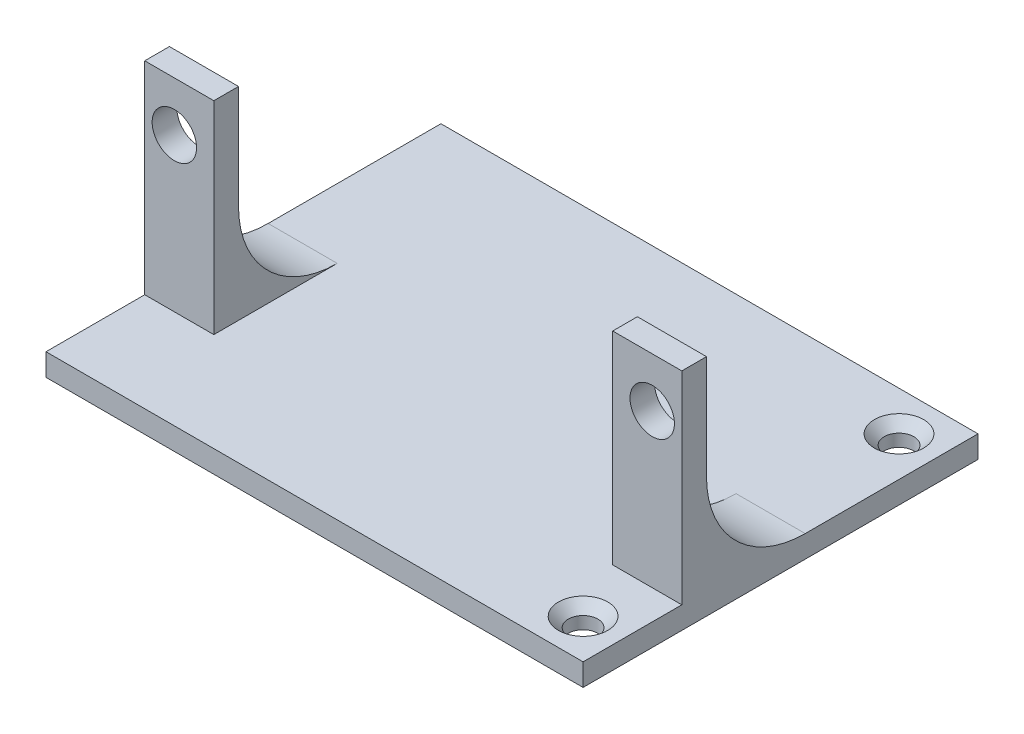
ISO-10303-21;
HEADER;
FILE_DESCRIPTION(('STEP AP214'),'2;1');
FILE_NAME('part.step','',(''),(''),'','','');
FILE_SCHEMA(('AUTOMOTIVE_DESIGN { 1 0 10303 214 1 1 1 1 }'));
ENDSEC;
DATA;
#1=APPLICATION_CONTEXT('core data for automotive mechanical design processes');
#2=APPLICATION_PROTOCOL_DEFINITION('international standard','automotive_design',2000,#1);
#3=PRODUCT_CONTEXT('',#1,'mechanical');
#4=PRODUCT('Part','Part','',(#3));
#5=PRODUCT_RELATED_PRODUCT_CATEGORY('part','',(#4));
#6=PRODUCT_DEFINITION_FORMATION('','',#4);
#7=PRODUCT_DEFINITION_CONTEXT('part definition',#1,'design');
#8=PRODUCT_DEFINITION('design','',#6,#7);
#9=PRODUCT_DEFINITION_SHAPE('','',#8);
#10=(LENGTH_UNIT() NAMED_UNIT(*) SI_UNIT(.MILLI.,.METRE.));
#11=(NAMED_UNIT(*) PLANE_ANGLE_UNIT() SI_UNIT($,.RADIAN.));
#12=(NAMED_UNIT(*) SI_UNIT($,.STERADIAN.) SOLID_ANGLE_UNIT());
#13=UNCERTAINTY_MEASURE_WITH_UNIT(LENGTH_MEASURE(1.E-05),#10,'distance_accuracy_value','');
#14=(GEOMETRIC_REPRESENTATION_CONTEXT(3) GLOBAL_UNCERTAINTY_ASSIGNED_CONTEXT((#13)) GLOBAL_UNIT_ASSIGNED_CONTEXT((#10,
#11,#12)) REPRESENTATION_CONTEXT('',''));
#15=CARTESIAN_POINT('',(0.,0.,0.));
#16=DIRECTION('',(0.,0.,1.));
#17=DIRECTION('',(1.,0.,0.));
#18=AXIS2_PLACEMENT_3D('',#15,#16,#17);
#19=CARTESIAN_POINT('',(0.,0.,6.));
#20=DIRECTION('',(0.,0.,1.));
#21=DIRECTION('',(1.,0.,0.));
#22=AXIS2_PLACEMENT_3D('',#19,#20,#21);
#23=PLANE('',#22);
#24=DIRECTION('',(-1.,0.,0.));
#25=VECTOR('',#24,1.);
#26=CARTESIAN_POINT('',(3.5,2.5,6.));
#27=LINE('',#26,#25);
#28=CARTESIAN_POINT('',(3.5,2.5,6.));
#29=VERTEX_POINT('',#28);
#30=CARTESIAN_POINT('',(-3.5,2.5,6.));
#31=VERTEX_POINT('',#30);
#32=EDGE_CURVE('E295',#29,#31,#27,.T.);
#33=ORIENTED_EDGE('',*,*,#32,.F.);
#34=DIRECTION('',(0.,1.,0.));
#35=VECTOR('',#34,1.);
#36=CARTESIAN_POINT('',(3.5,3.,6.));
#37=LINE('',#36,#35);
#38=CARTESIAN_POINT('',(3.5,23.02,6.));
#39=VERTEX_POINT('',#38);
#40=EDGE_CURVE('E225',#29,#39,#37,.T.);
#41=ORIENTED_EDGE('',*,*,#40,.T.);
#42=DIRECTION('',(-1.,0.,0.));
#43=VECTOR('',#42,1.);
#44=CARTESIAN_POINT('',(3.5,23.02,6.));
#45=LINE('',#44,#43);
#46=CARTESIAN_POINT('',(-3.5,23.02,6.));
#47=VERTEX_POINT('',#46);
#48=EDGE_CURVE('E229',#39,#47,#45,.T.);
#49=ORIENTED_EDGE('',*,*,#48,.T.);
#50=DIRECTION('',(0.,-1.,0.));
#51=VECTOR('',#50,1.);
#52=CARTESIAN_POINT('',(-3.5,3.,6.));
#53=LINE('',#52,#51);
#54=EDGE_CURVE('E222',#47,#31,#53,.T.);
#55=ORIENTED_EDGE('',*,*,#54,.T.);
#56=EDGE_LOOP('',(#33,#41,#49,#55));
#57=FACE_BOUND('',#56,.T.);
#58=CARTESIAN_POINT('',(0.500000000000005,18.01,6.));
#59=DIRECTION('',(0.,0.,1.));
#60=DIRECTION('',(1.,0.,0.));
#61=AXIS2_PLACEMENT_3D('',#58,#59,#60);
#62=CIRCLE('',#61,2.25);
#63=CARTESIAN_POINT('',(2.75000000000001,18.01,6.));
#64=VERTEX_POINT('',#63);
#65=EDGE_CURVE('E214',#64,#64,#62,.T.);
#66=ORIENTED_EDGE('',*,*,#65,.F.);
#67=EDGE_LOOP('',(#66));
#68=FACE_BOUND('',#67,.T.);
#69=ADVANCED_FACE('F45',(#57,#68),#23,.T.);
#70=CARTESIAN_POINT('',(0.,0.,-24.));
#71=DIRECTION('',(0.,0.,-1.));
#72=DIRECTION('',(-1.,0.,0.));
#73=AXIS2_PLACEMENT_3D('',#70,#71,#72);
#74=PLANE('',#73);
#75=DIRECTION('',(-1.,0.,0.));
#76=VECTOR('',#75,1.);
#77=CARTESIAN_POINT('',(3.5,0.25,-24.));
#78=LINE('',#77,#76);
#79=CARTESIAN_POINT('',(3.5,0.25,-24.));
#80=VERTEX_POINT('',#79);
#81=CARTESIAN_POINT('',(-50.9,0.25,-24.));
#82=VERTEX_POINT('',#81);
#83=EDGE_CURVE('E146',#80,#82,#78,.T.);
#84=ORIENTED_EDGE('',*,*,#83,.T.);
#85=DIRECTION('',(0.,1.,0.));
#86=VECTOR('',#85,1.);
#87=CARTESIAN_POINT('',(-50.9,-2.,-24.));
#88=LINE('',#87,#86);
#89=CARTESIAN_POINT('',(-50.9,2.5,-24.));
#90=VERTEX_POINT('',#89);
#91=EDGE_CURVE('E174',#82,#90,#88,.T.);
#92=ORIENTED_EDGE('',*,*,#91,.T.);
#93=DIRECTION('',(-1.,0.,0.));
#94=VECTOR('',#93,1.);
#95=CARTESIAN_POINT('',(3.5,2.5,-24.));
#96=LINE('',#95,#94);
#97=CARTESIAN_POINT('',(3.5,2.5,-24.));
#98=VERTEX_POINT('',#97);
#99=EDGE_CURVE('E171',#98,#90,#96,.T.);
#100=ORIENTED_EDGE('',*,*,#99,.F.);
#101=DIRECTION('',(0.,-1.,0.));
#102=VECTOR('',#101,1.);
#103=CARTESIAN_POINT('',(3.5,3.,-24.));
#104=LINE('',#103,#102);
#105=EDGE_CURVE('E163',#98,#80,#104,.T.);
#106=ORIENTED_EDGE('',*,*,#105,.T.);
#107=EDGE_LOOP('',(#84,#92,#100,#106));
#108=FACE_BOUND('',#107,.T.);
#109=ADVANCED_FACE('F169',(#108),#74,.T.);
#110=CARTESIAN_POINT('',(-3.5,3.,-3.5));
#111=DIRECTION('',(1.,0.,0.));
#112=DIRECTION('',(0.,0.,-1.));
#113=AXIS2_PLACEMENT_3D('',#110,#111,#112);
#114=PLANE('',#113);
#115=DIRECTION('',(0.,-1.,0.));
#116=VECTOR('',#115,1.);
#117=CARTESIAN_POINT('',(-3.5,23.02,3.5));
#118=LINE('',#117,#116);
#119=CARTESIAN_POINT('',(-3.5,23.02,3.5));
#120=VERTEX_POINT('',#119);
#121=CARTESIAN_POINT('',(-3.5,12.5,3.5));
#122=VERTEX_POINT('',#121);
#123=EDGE_CURVE('E226',#120,#122,#118,.T.);
#124=ORIENTED_EDGE('',*,*,#123,.T.);
#125=CARTESIAN_POINT('',(-3.5,12.5,-6.5));
#126=DIRECTION('',(1.,0.,0.));
#127=DIRECTION('',(0.,0.,-1.));
#128=AXIS2_PLACEMENT_3D('',#125,#126,#127);
#129=CIRCLE('',#128,10.);
#130=CARTESIAN_POINT('',(-3.5,2.5,-6.5));
#131=VERTEX_POINT('',#130);
#132=EDGE_CURVE('E11',#122,#131,#129,.T.);
#133=ORIENTED_EDGE('',*,*,#132,.T.);
#134=DIRECTION('',(0.,0.,-1.));
#135=VECTOR('',#134,1.);
#136=CARTESIAN_POINT('',(-3.5,2.5,6.));
#137=LINE('',#136,#135);
#138=EDGE_CURVE('E181',#31,#131,#137,.T.);
#139=ORIENTED_EDGE('',*,*,#138,.F.);
#140=ORIENTED_EDGE('',*,*,#54,.F.);
#141=DIRECTION('',(0.,0.,-1.));
#142=VECTOR('',#141,1.);
#143=CARTESIAN_POINT('',(-3.5,23.02,6.));
#144=LINE('',#143,#142);
#145=EDGE_CURVE('E233',#47,#120,#144,.T.);
#146=ORIENTED_EDGE('',*,*,#145,.T.);
#147=EDGE_LOOP('',(#124,#133,#139,#140,#146));
#148=FACE_BOUND('',#147,.T.);
#149=ADVANCED_FACE('F346',(#148),#114,.F.);
#150=CARTESIAN_POINT('',(3.5,3.,-3.5));
#151=DIRECTION('',(-1.,0.,0.));
#152=DIRECTION('',(0.,0.,1.));
#153=AXIS2_PLACEMENT_3D('',#150,#151,#152);
#154=PLANE('',#153);
#155=DIRECTION('',(0.,1.,0.));
#156=VECTOR('',#155,1.);
#157=CARTESIAN_POINT('',(3.5,2.5,16.));
#158=LINE('',#157,#156);
#159=CARTESIAN_POINT('',(3.5,0.25,16.));
#160=VERTEX_POINT('',#159);
#161=CARTESIAN_POINT('',(3.5,2.5,16.));
#162=VERTEX_POINT('',#161);
#163=EDGE_CURVE('E165',#160,#162,#158,.T.);
#164=ORIENTED_EDGE('',*,*,#163,.F.);
#165=DIRECTION('',(0.,0.,1.));
#166=VECTOR('',#165,1.);
#167=CARTESIAN_POINT('',(3.5,0.25,-24.));
#168=LINE('',#167,#166);
#169=EDGE_CURVE('E150',#80,#160,#168,.T.);
#170=ORIENTED_EDGE('',*,*,#169,.F.);
#171=ORIENTED_EDGE('',*,*,#105,.F.);
#172=DIRECTION('',(0.,0.,-1.));
#173=VECTOR('',#172,1.);
#174=CARTESIAN_POINT('',(3.5,2.5,3.5));
#175=LINE('',#174,#173);
#176=CARTESIAN_POINT('',(3.5,2.5,-6.5));
#177=VERTEX_POINT('',#176);
#178=EDGE_CURVE('E327',#177,#98,#175,.T.);
#179=ORIENTED_EDGE('',*,*,#178,.F.);
#180=CARTESIAN_POINT('',(3.5,12.5,-6.5));
#181=DIRECTION('',(-1.,0.,0.));
#182=DIRECTION('',(0.,0.,1.));
#183=AXIS2_PLACEMENT_3D('',#180,#181,#182);
#184=CIRCLE('',#183,10.);
#185=CARTESIAN_POINT('',(3.5,12.5,3.5));
#186=VERTEX_POINT('',#185);
#187=EDGE_CURVE('E54',#177,#186,#184,.T.);
#188=ORIENTED_EDGE('',*,*,#187,.T.);
#189=DIRECTION('',(0.,1.,0.));
#190=VECTOR('',#189,1.);
#191=CARTESIAN_POINT('',(3.5,3.,3.5));
#192=LINE('',#191,#190);
#193=CARTESIAN_POINT('',(3.5,23.02,3.5));
#194=VERTEX_POINT('',#193);
#195=EDGE_CURVE('E218',#186,#194,#192,.T.);
#196=ORIENTED_EDGE('',*,*,#195,.T.);
#197=DIRECTION('',(0.,0.,-1.));
#198=VECTOR('',#197,1.);
#199=CARTESIAN_POINT('',(3.5,23.02,6.));
#200=LINE('',#199,#198);
#201=EDGE_CURVE('E244',#39,#194,#200,.T.);
#202=ORIENTED_EDGE('',*,*,#201,.F.);
#203=ORIENTED_EDGE('',*,*,#40,.F.);
#204=DIRECTION('',(0.,0.,-1.));
#205=VECTOR('',#204,1.);
#206=CARTESIAN_POINT('',(3.5,2.5,16.));
#207=LINE('',#206,#205);
#208=EDGE_CURVE('E323',#162,#29,#207,.T.);
#209=ORIENTED_EDGE('',*,*,#208,.F.);
#210=EDGE_LOOP('',(#164,#170,#171,#179,#188,#196,#202,#203,#209));
#211=FACE_BOUND('',#210,.T.);
#212=ADVANCED_FACE('F162',(#211),#154,.F.);
#213=CARTESIAN_POINT('',(-43.9,2.5,6.));
#214=VERTEX_POINT('',#213);
#215=CARTESIAN_POINT('',(-50.9,2.5,6.));
#216=VERTEX_POINT('',#215);
#217=EDGE_CURVE('E248',#214,#216,#27,.T.);
#218=ORIENTED_EDGE('',*,*,#217,.F.);
#219=DIRECTION('',(0.,1.,0.));
#220=VECTOR('',#219,1.);
#221=CARTESIAN_POINT('',(-43.9,3.,6.));
#222=LINE('',#221,#220);
#223=CARTESIAN_POINT('',(-43.9,23.02,6.));
#224=VERTEX_POINT('',#223);
#225=EDGE_CURVE('E197',#214,#224,#222,.T.);
#226=ORIENTED_EDGE('',*,*,#225,.T.);
#227=DIRECTION('',(1.,0.,0.));
#228=VECTOR('',#227,1.);
#229=CARTESIAN_POINT('',(-50.9,23.02,6.00000000000001));
#230=LINE('',#229,#228);
#231=CARTESIAN_POINT('',(-50.9,23.02,6.00000000000001));
#232=VERTEX_POINT('',#231);
#233=EDGE_CURVE('E209',#232,#224,#230,.T.);
#234=ORIENTED_EDGE('',*,*,#233,.F.);
#235=DIRECTION('',(0.,1.,0.));
#236=VECTOR('',#235,1.);
#237=CARTESIAN_POINT('',(-50.9,-2.,6.00000000000001));
#238=LINE('',#237,#236);
#239=EDGE_CURVE('E185',#216,#232,#238,.T.);
#240=ORIENTED_EDGE('',*,*,#239,.F.);
#241=EDGE_LOOP('',(#218,#226,#234,#240));
#242=FACE_BOUND('',#241,.T.);
#243=CARTESIAN_POINT('',(-47.9,18.01,6.));
#244=DIRECTION('',(0.,0.,1.));
#245=DIRECTION('',(-1.,0.,0.));
#246=AXIS2_PLACEMENT_3D('',#243,#244,#245);
#247=CIRCLE('',#246,2.25);
#248=CARTESIAN_POINT('',(-50.15,18.01,6.));
#249=VERTEX_POINT('',#248);
#250=EDGE_CURVE('E173',#249,#249,#247,.T.);
#251=ORIENTED_EDGE('',*,*,#250,.F.);
#252=EDGE_LOOP('',(#251));
#253=FACE_BOUND('',#252,.T.);
#254=ADVANCED_FACE('F357',(#242,#253),#23,.T.);
#255=CARTESIAN_POINT('',(0.,0.,3.5));
#256=DIRECTION('',(0.,0.,1.));
#257=DIRECTION('',(1.,0.,0.));
#258=AXIS2_PLACEMENT_3D('',#255,#256,#257);
#259=PLANE('',#258);
#260=ORIENTED_EDGE('',*,*,#195,.F.);
#261=DIRECTION('',(1.,0.,0.));
#262=VECTOR('',#261,1.);
#263=CARTESIAN_POINT('',(0.,12.5,3.5));
#264=LINE('',#263,#262);
#265=EDGE_CURVE('E61',#186,#122,#264,.F.);
#266=ORIENTED_EDGE('',*,*,#265,.T.);
#267=ORIENTED_EDGE('',*,*,#123,.F.);
#268=DIRECTION('',(-1.,0.,0.));
#269=VECTOR('',#268,1.);
#270=CARTESIAN_POINT('',(3.5,23.02,3.5));
#271=LINE('',#270,#269);
#272=EDGE_CURVE('E236',#194,#120,#271,.T.);
#273=ORIENTED_EDGE('',*,*,#272,.F.);
#274=EDGE_LOOP('',(#260,#266,#267,#273));
#275=FACE_BOUND('',#274,.T.);
#276=CARTESIAN_POINT('',(0.500000000000005,18.01,3.5));
#277=DIRECTION('',(0.,0.,1.));
#278=DIRECTION('',(1.,0.,0.));
#279=AXIS2_PLACEMENT_3D('',#276,#277,#278);
#280=CIRCLE('',#279,2.25);
#281=CARTESIAN_POINT('',(2.75000000000001,18.01,3.5));
#282=VERTEX_POINT('',#281);
#283=EDGE_CURVE('E213',#282,#282,#280,.T.);
#284=ORIENTED_EDGE('',*,*,#283,.T.);
#285=EDGE_LOOP('',(#284));
#286=FACE_BOUND('',#285,.T.);
#287=ADVANCED_FACE('F366',(#275,#286),#259,.F.);
#288=CARTESIAN_POINT('',(3.5,23.02,6.));
#289=DIRECTION('',(0.,-1.,0.));
#290=DIRECTION('',(0.,0.,-1.));
#291=AXIS2_PLACEMENT_3D('',#288,#289,#290);
#292=PLANE('',#291);
#293=ORIENTED_EDGE('',*,*,#272,.T.);
#294=ORIENTED_EDGE('',*,*,#145,.F.);
#295=ORIENTED_EDGE('',*,*,#48,.F.);
#296=ORIENTED_EDGE('',*,*,#201,.T.);
#297=EDGE_LOOP('',(#293,#294,#295,#296));
#298=FACE_BOUND('',#297,.T.);
#299=ADVANCED_FACE('F372',(#298),#292,.F.);
#300=CARTESIAN_POINT('',(0.500000000000005,18.01,6.));
#301=DIRECTION('',(0.,0.,-1.));
#302=DIRECTION('',(-1.,0.,0.));
#303=AXIS2_PLACEMENT_3D('',#300,#301,#302);
#304=CYLINDRICAL_SURFACE('',#303,2.25);
#305=ORIENTED_EDGE('',*,*,#65,.T.);
#306=EDGE_LOOP('',(#305));
#307=FACE_BOUND('',#306,.T.);
#308=ORIENTED_EDGE('',*,*,#283,.F.);
#309=EDGE_LOOP('',(#308));
#310=FACE_BOUND('',#309,.T.);
#311=ADVANCED_FACE('F405',(#307,#310),#304,.F.);
#312=CARTESIAN_POINT('',(-50.9,23.02,6.00000000000001));
#313=DIRECTION('',(0.,-1.,0.));
#314=DIRECTION('',(0.,0.,-1.));
#315=AXIS2_PLACEMENT_3D('',#312,#313,#314);
#316=PLANE('',#315);
#317=DIRECTION('',(0.,0.,-1.));
#318=VECTOR('',#317,1.);
#319=CARTESIAN_POINT('',(-43.9,23.02,6.));
#320=LINE('',#319,#318);
#321=CARTESIAN_POINT('',(-43.9,23.02,3.5));
#322=VERTEX_POINT('',#321);
#323=EDGE_CURVE('E200',#224,#322,#320,.T.);
#324=ORIENTED_EDGE('',*,*,#323,.T.);
#325=DIRECTION('',(1.,0.,0.));
#326=VECTOR('',#325,1.);
#327=CARTESIAN_POINT('',(-50.9,23.02,3.50000000000001));
#328=LINE('',#327,#326);
#329=CARTESIAN_POINT('',(-50.9,23.02,3.50000000000001));
#330=VERTEX_POINT('',#329);
#331=EDGE_CURVE('E196',#330,#322,#328,.T.);
#332=ORIENTED_EDGE('',*,*,#331,.F.);
#333=DIRECTION('',(0.,0.,-1.));
#334=VECTOR('',#333,1.);
#335=CARTESIAN_POINT('',(-50.9,23.02,6.00000000000001));
#336=LINE('',#335,#334);
#337=EDGE_CURVE('E188',#232,#330,#336,.T.);
#338=ORIENTED_EDGE('',*,*,#337,.F.);
#339=ORIENTED_EDGE('',*,*,#233,.T.);
#340=EDGE_LOOP('',(#324,#332,#338,#339));
#341=FACE_BOUND('',#340,.T.);
#342=ADVANCED_FACE('F389',(#341),#316,.F.);
#343=CARTESIAN_POINT('',(-50.9,23.02,3.50000000000001));
#344=DIRECTION('',(0.,0.,1.));
#345=DIRECTION('',(1.,0.,0.));
#346=AXIS2_PLACEMENT_3D('',#343,#344,#345);
#347=PLANE('',#346);
#348=CARTESIAN_POINT('',(-47.9,18.01,3.5));
#349=DIRECTION('',(0.,0.,1.));
#350=DIRECTION('',(1.,0.,0.));
#351=AXIS2_PLACEMENT_3D('',#348,#349,#350);
#352=CIRCLE('',#351,2.25);
#353=CARTESIAN_POINT('',(-45.65,18.01,3.5));
#354=VERTEX_POINT('',#353);
#355=EDGE_CURVE('E179',#354,#354,#352,.T.);
#356=ORIENTED_EDGE('',*,*,#355,.T.);
#357=EDGE_LOOP('',(#356));
#358=FACE_BOUND('',#357,.T.);
#359=DIRECTION('',(0.,-1.,0.));
#360=VECTOR('',#359,1.);
#361=CARTESIAN_POINT('',(-43.9,23.02,3.5));
#362=LINE('',#361,#360);
#363=CARTESIAN_POINT('',(-43.9,12.5,3.5));
#364=VERTEX_POINT('',#363);
#365=EDGE_CURVE('E189',#322,#364,#362,.T.);
#366=ORIENTED_EDGE('',*,*,#365,.T.);
#367=DIRECTION('',(1.,0.,0.));
#368=VECTOR('',#367,1.);
#369=CARTESIAN_POINT('',(-50.9,12.5,3.50000000000001));
#370=LINE('',#369,#368);
#371=CARTESIAN_POINT('',(-50.9,12.5,3.50000000000001));
#372=VERTEX_POINT('',#371);
#373=EDGE_CURVE('E281',#364,#372,#370,.F.);
#374=ORIENTED_EDGE('',*,*,#373,.T.);
#375=DIRECTION('',(0.,-1.,0.));
#376=VECTOR('',#375,1.);
#377=CARTESIAN_POINT('',(-50.9,23.02,3.50000000000001));
#378=LINE('',#377,#376);
#379=EDGE_CURVE('E192',#330,#372,#378,.T.);
#380=ORIENTED_EDGE('',*,*,#379,.F.);
#381=ORIENTED_EDGE('',*,*,#331,.T.);
#382=EDGE_LOOP('',(#366,#374,#380,#381));
#383=FACE_BOUND('',#382,.T.);
#384=ADVANCED_FACE('F385',(#358,#383),#347,.F.);
#385=CARTESIAN_POINT('',(-50.9,0.,0.));
#386=DIRECTION('',(1.,0.,0.));
#387=DIRECTION('',(0.,0.,-1.));
#388=AXIS2_PLACEMENT_3D('',#385,#386,#387);
#389=PLANE('',#388);
#390=ORIENTED_EDGE('',*,*,#91,.F.);
#391=DIRECTION('',(0.,0.,1.));
#392=VECTOR('',#391,1.);
#393=CARTESIAN_POINT('',(-50.9,0.25,-24.));
#394=LINE('',#393,#392);
#395=CARTESIAN_POINT('',(-50.9,0.25,16.));
#396=VERTEX_POINT('',#395);
#397=EDGE_CURVE('E153',#82,#396,#394,.T.);
#398=ORIENTED_EDGE('',*,*,#397,.T.);
#399=DIRECTION('',(0.,-1.,0.));
#400=VECTOR('',#399,1.);
#401=CARTESIAN_POINT('',(-50.9,2.5,16.));
#402=LINE('',#401,#400);
#403=CARTESIAN_POINT('',(-50.9,2.5,16.));
#404=VERTEX_POINT('',#403);
#405=EDGE_CURVE('E304',#404,#396,#402,.T.);
#406=ORIENTED_EDGE('',*,*,#405,.F.);
#407=DIRECTION('',(0.,0.,-1.));
#408=VECTOR('',#407,1.);
#409=CARTESIAN_POINT('',(-50.9,2.5,16.));
#410=LINE('',#409,#408);
#411=EDGE_CURVE('E319',#404,#216,#410,.T.);
#412=ORIENTED_EDGE('',*,*,#411,.T.);
#413=ORIENTED_EDGE('',*,*,#239,.T.);
#414=ORIENTED_EDGE('',*,*,#337,.T.);
#415=ORIENTED_EDGE('',*,*,#379,.T.);
#416=CARTESIAN_POINT('',(-50.9,12.5,-6.5));
#417=DIRECTION('',(1.,0.,0.));
#418=DIRECTION('',(0.,0.,-1.));
#419=AXIS2_PLACEMENT_3D('',#416,#417,#418);
#420=CIRCLE('',#419,10.);
#421=CARTESIAN_POINT('',(-50.9,2.5,-6.5));
#422=VERTEX_POINT('',#421);
#423=EDGE_CURVE('E289',#372,#422,#420,.T.);
#424=ORIENTED_EDGE('',*,*,#423,.T.);
#425=DIRECTION('',(0.,0.,1.));
#426=VECTOR('',#425,1.);
#427=CARTESIAN_POINT('',(-50.9,2.5,-24.));
#428=LINE('',#427,#426);
#429=EDGE_CURVE('E334',#90,#422,#428,.T.);
#430=ORIENTED_EDGE('',*,*,#429,.F.);
#431=EDGE_LOOP('',(#390,#398,#406,#412,#413,#414,#415,#424,#430));
#432=FACE_BOUND('',#431,.T.);
#433=ADVANCED_FACE('F388',(#432),#389,.F.);
#434=CARTESIAN_POINT('',(-43.9,0.,0.));
#435=DIRECTION('',(1.,0.,0.));
#436=DIRECTION('',(0.,0.,-1.));
#437=AXIS2_PLACEMENT_3D('',#434,#435,#436);
#438=PLANE('',#437);
#439=ORIENTED_EDGE('',*,*,#225,.F.);
#440=DIRECTION('',(0.,0.,1.));
#441=VECTOR('',#440,1.);
#442=CARTESIAN_POINT('',(-43.9,2.5,3.5));
#443=LINE('',#442,#441);
#444=CARTESIAN_POINT('',(-43.9,2.5,-6.5));
#445=VERTEX_POINT('',#444);
#446=EDGE_CURVE('E338',#445,#214,#443,.T.);
#447=ORIENTED_EDGE('',*,*,#446,.F.);
#448=CARTESIAN_POINT('',(-43.9,12.5,-6.5));
#449=DIRECTION('',(1.,0.,0.));
#450=DIRECTION('',(0.,0.,-1.));
#451=AXIS2_PLACEMENT_3D('',#448,#449,#450);
#452=CIRCLE('',#451,10.);
#453=EDGE_CURVE('E286',#445,#364,#452,.F.);
#454=ORIENTED_EDGE('',*,*,#453,.T.);
#455=ORIENTED_EDGE('',*,*,#365,.F.);
#456=ORIENTED_EDGE('',*,*,#323,.F.);
#457=EDGE_LOOP('',(#439,#447,#454,#455,#456));
#458=FACE_BOUND('',#457,.T.);
#459=ADVANCED_FACE('F381',(#458),#438,.T.);
#460=CARTESIAN_POINT('',(-47.9,18.01,1.5));
#461=DIRECTION('',(0.,0.,1.));
#462=DIRECTION('',(1.,0.,0.));
#463=AXIS2_PLACEMENT_3D('',#460,#461,#462);
#464=CYLINDRICAL_SURFACE('',#463,2.25);
#465=ORIENTED_EDGE('',*,*,#250,.T.);
#466=EDGE_LOOP('',(#465));
#467=FACE_BOUND('',#466,.T.);
#468=ORIENTED_EDGE('',*,*,#355,.F.);
#469=EDGE_LOOP('',(#468));
#470=FACE_BOUND('',#469,.T.);
#471=ADVANCED_FACE('F378',(#467,#470),#464,.F.);
#472=CARTESIAN_POINT('',(0.,2.5,0.));
#473=DIRECTION('',(0.,1.,0.));
#474=DIRECTION('',(0.,0.,1.));
#475=AXIS2_PLACEMENT_3D('',#472,#473,#474);
#476=PLANE('',#475);
#477=CARTESIAN_POINT('',(-0.500000000000001,2.5,12.));
#478=DIRECTION('',(0.,1.,0.));
#479=DIRECTION('',(0.,0.,1.));
#480=AXIS2_PLACEMENT_3D('',#477,#478,#479);
#481=CIRCLE('',#480,2.50000000000002);
#482=CARTESIAN_POINT('',(-0.500000000000001,2.5,14.5));
#483=VERTEX_POINT('',#482);
#484=EDGE_CURVE('E260',#483,#483,#481,.F.);
#485=ORIENTED_EDGE('',*,*,#484,.T.);
#486=EDGE_LOOP('',(#485));
#487=FACE_BOUND('',#486,.T.);
#488=CARTESIAN_POINT('',(-0.499999999999998,2.5,-20.));
#489=DIRECTION('',(0.,1.,0.));
#490=DIRECTION('',(0.,0.,1.));
#491=AXIS2_PLACEMENT_3D('',#488,#489,#490);
#492=CIRCLE('',#491,2.50000000000002);
#493=CARTESIAN_POINT('',(-0.499999999999998,2.5,-17.5));
#494=VERTEX_POINT('',#493);
#495=EDGE_CURVE('E256',#494,#494,#492,.F.);
#496=ORIENTED_EDGE('',*,*,#495,.T.);
#497=EDGE_LOOP('',(#496));
#498=FACE_BOUND('',#497,.T.);
#499=ORIENTED_EDGE('',*,*,#429,.T.);
#500=DIRECTION('',(1.,0.,0.));
#501=VECTOR('',#500,1.);
#502=CARTESIAN_POINT('',(0.,2.5,-6.5));
#503=LINE('',#502,#501);
#504=EDGE_CURVE('E277',#422,#445,#503,.T.);
#505=ORIENTED_EDGE('',*,*,#504,.T.);
#506=ORIENTED_EDGE('',*,*,#446,.T.);
#507=ORIENTED_EDGE('',*,*,#217,.T.);
#508=ORIENTED_EDGE('',*,*,#411,.F.);
#509=DIRECTION('',(-1.,0.,0.));
#510=VECTOR('',#509,1.);
#511=CARTESIAN_POINT('',(3.5,2.5,16.));
#512=LINE('',#511,#510);
#513=EDGE_CURVE('E317',#162,#404,#512,.T.);
#514=ORIENTED_EDGE('',*,*,#513,.F.);
#515=ORIENTED_EDGE('',*,*,#208,.T.);
#516=ORIENTED_EDGE('',*,*,#32,.T.);
#517=ORIENTED_EDGE('',*,*,#138,.T.);
#518=DIRECTION('',(1.,0.,0.));
#519=VECTOR('',#518,1.);
#520=CARTESIAN_POINT('',(0.,2.5,-6.5));
#521=LINE('',#520,#519);
#522=EDGE_CURVE('E268',#131,#177,#521,.T.);
#523=ORIENTED_EDGE('',*,*,#522,.T.);
#524=ORIENTED_EDGE('',*,*,#178,.T.);
#525=ORIENTED_EDGE('',*,*,#99,.T.);
#526=EDGE_LOOP('',(#499,#505,#506,#507,#508,#514,#515,#516,#517,#523,#524,#525));
#527=FACE_BOUND('',#526,.T.);
#528=ADVANCED_FACE('F342',(#487,#498,#527),#476,.T.);
#529=CARTESIAN_POINT('',(0.,0.,16.));
#530=DIRECTION('',(0.,0.,-1.));
#531=DIRECTION('',(-1.,0.,0.));
#532=AXIS2_PLACEMENT_3D('',#529,#530,#531);
#533=PLANE('',#532);
#534=ORIENTED_EDGE('',*,*,#405,.T.);
#535=DIRECTION('',(-1.,0.,0.));
#536=VECTOR('',#535,1.);
#537=CARTESIAN_POINT('',(3.5,0.25,16.));
#538=LINE('',#537,#536);
#539=EDGE_CURVE('E158',#160,#396,#538,.T.);
#540=ORIENTED_EDGE('',*,*,#539,.F.);
#541=ORIENTED_EDGE('',*,*,#163,.T.);
#542=ORIENTED_EDGE('',*,*,#513,.T.);
#543=EDGE_LOOP('',(#534,#540,#541,#542));
#544=FACE_BOUND('',#543,.T.);
#545=ADVANCED_FACE('F418',(#544),#533,.F.);
#546=CARTESIAN_POINT('',(-0.499999999999998,23.02,-20.));
#547=DIRECTION('',(0.,-1.,0.));
#548=DIRECTION('',(0.,0.,-1.));
#549=AXIS2_PLACEMENT_3D('',#546,#547,#548);
#550=CYLINDRICAL_SURFACE('',#549,1.5);
#551=CARTESIAN_POINT('',(-0.499999999999998,0.25,-20.));
#552=DIRECTION('',(0.,1.,0.));
#553=DIRECTION('',(0.,0.,1.));
#554=AXIS2_PLACEMENT_3D('',#551,#552,#553);
#555=CIRCLE('',#554,1.5);
#556=CARTESIAN_POINT('',(-0.499999999999998,0.25,-18.5));
#557=VERTEX_POINT('',#556);
#558=EDGE_CURVE('E273',#557,#557,#555,.F.);
#559=ORIENTED_EDGE('',*,*,#558,.T.);
#560=EDGE_LOOP('',(#559));
#561=FACE_BOUND('',#560,.T.);
#562=CARTESIAN_POINT('',(-0.499999999999998,1.49999999999998,-20.));
#563=DIRECTION('',(0.,1.,0.));
#564=DIRECTION('',(0.,0.,1.));
#565=AXIS2_PLACEMENT_3D('',#562,#563,#564);
#566=CIRCLE('',#565,1.5);
#567=CARTESIAN_POINT('',(-0.499999999999998,1.49999999999998,-18.5));
#568=VERTEX_POINT('',#567);
#569=EDGE_CURVE('E264',#568,#568,#566,.T.);
#570=ORIENTED_EDGE('',*,*,#569,.T.);
#571=EDGE_LOOP('',(#570));
#572=FACE_BOUND('',#571,.T.);
#573=ADVANCED_FACE('F422',(#561,#572),#550,.F.);
#574=CARTESIAN_POINT('',(-0.500000000000001,23.02,12.));
#575=DIRECTION('',(0.,-1.,0.));
#576=DIRECTION('',(0.,0.,-1.));
#577=AXIS2_PLACEMENT_3D('',#574,#575,#576);
#578=CYLINDRICAL_SURFACE('',#577,1.5);
#579=CARTESIAN_POINT('',(-0.500000000000001,0.25,12.));
#580=DIRECTION('',(0.,1.,0.));
#581=DIRECTION('',(0.,0.,1.));
#582=AXIS2_PLACEMENT_3D('',#579,#580,#581);
#583=CIRCLE('',#582,1.5);
#584=CARTESIAN_POINT('',(-0.500000000000001,0.25,13.5));
#585=VERTEX_POINT('',#584);
#586=EDGE_CURVE('E269',#585,#585,#583,.F.);
#587=ORIENTED_EDGE('',*,*,#586,.T.);
#588=EDGE_LOOP('',(#587));
#589=FACE_BOUND('',#588,.T.);
#590=CARTESIAN_POINT('',(-0.500000000000001,1.49999999999999,12.));
#591=DIRECTION('',(0.,1.,0.));
#592=DIRECTION('',(0.,0.,1.));
#593=AXIS2_PLACEMENT_3D('',#590,#591,#592);
#594=CIRCLE('',#593,1.5);
#595=CARTESIAN_POINT('',(-0.500000000000001,1.49999999999999,13.5));
#596=VERTEX_POINT('',#595);
#597=EDGE_CURVE('E252',#596,#596,#594,.T.);
#598=ORIENTED_EDGE('',*,*,#597,.T.);
#599=EDGE_LOOP('',(#598));
#600=FACE_BOUND('',#599,.T.);
#601=ADVANCED_FACE('F425',(#589,#600),#578,.F.);
#602=CARTESIAN_POINT('',(-0.500000000000001,1.49999999999999,12.));
#603=DIRECTION('',(0.,1.,0.));
#604=DIRECTION('',(0.,0.,1.));
#605=AXIS2_PLACEMENT_3D('',#602,#603,#604);
#606=CONICAL_SURFACE('',#605,1.5,0.785398163397454);
#607=ORIENTED_EDGE('',*,*,#484,.F.);
#608=EDGE_LOOP('',(#607));
#609=FACE_BOUND('',#608,.T.);
#610=ORIENTED_EDGE('',*,*,#597,.F.);
#611=EDGE_LOOP('',(#610));
#612=FACE_BOUND('',#611,.T.);
#613=ADVANCED_FACE('F428',(#609,#612),#606,.F.);
#614=CARTESIAN_POINT('',(-0.499999999999998,1.49999999999998,-20.));
#615=DIRECTION('',(0.,1.,0.));
#616=DIRECTION('',(0.,0.,1.));
#617=AXIS2_PLACEMENT_3D('',#614,#615,#616);
#618=CONICAL_SURFACE('',#617,1.5,0.78539816339745);
#619=ORIENTED_EDGE('',*,*,#495,.F.);
#620=EDGE_LOOP('',(#619));
#621=FACE_BOUND('',#620,.T.);
#622=ORIENTED_EDGE('',*,*,#569,.F.);
#623=EDGE_LOOP('',(#622));
#624=FACE_BOUND('',#623,.T.);
#625=ADVANCED_FACE('F431',(#621,#624),#618,.F.);
#626=CARTESIAN_POINT('',(3.5,0.25,-24.));
#627=DIRECTION('',(0.,1.,0.));
#628=DIRECTION('',(0.,0.,1.));
#629=AXIS2_PLACEMENT_3D('',#626,#627,#628);
#630=PLANE('',#629);
#631=ORIENTED_EDGE('',*,*,#586,.F.);
#632=EDGE_LOOP('',(#631));
#633=FACE_BOUND('',#632,.T.);
#634=ORIENTED_EDGE('',*,*,#539,.T.);
#635=ORIENTED_EDGE('',*,*,#397,.F.);
#636=ORIENTED_EDGE('',*,*,#83,.F.);
#637=ORIENTED_EDGE('',*,*,#169,.T.);
#638=EDGE_LOOP('',(#634,#635,#636,#637));
#639=FACE_BOUND('',#638,.T.);
#640=ORIENTED_EDGE('',*,*,#558,.F.);
#641=EDGE_LOOP('',(#640));
#642=FACE_BOUND('',#641,.T.);
#643=ADVANCED_FACE('F148',(#633,#639,#642),#630,.F.);
#644=CARTESIAN_POINT('',(0.,12.5,-6.5));
#645=DIRECTION('',(1.,0.,0.));
#646=DIRECTION('',(0.,0.,-1.));
#647=AXIS2_PLACEMENT_3D('',#644,#645,#646);
#648=CYLINDRICAL_SURFACE('',#647,10.);
#649=ORIENTED_EDGE('',*,*,#423,.F.);
#650=ORIENTED_EDGE('',*,*,#373,.F.);
#651=ORIENTED_EDGE('',*,*,#453,.F.);
#652=ORIENTED_EDGE('',*,*,#504,.F.);
#653=EDGE_LOOP('',(#649,#650,#651,#652));
#654=FACE_BOUND('',#653,.T.);
#655=ADVANCED_FACE('F349',(#654),#648,.F.);
#656=CARTESIAN_POINT('',(0.,12.5,-6.5));
#657=DIRECTION('',(1.,0.,0.));
#658=DIRECTION('',(0.,0.,-1.));
#659=AXIS2_PLACEMENT_3D('',#656,#657,#658);
#660=CYLINDRICAL_SURFACE('',#659,10.);
#661=ORIENTED_EDGE('',*,*,#132,.F.);
#662=ORIENTED_EDGE('',*,*,#265,.F.);
#663=ORIENTED_EDGE('',*,*,#187,.F.);
#664=ORIENTED_EDGE('',*,*,#522,.F.);
#665=EDGE_LOOP('',(#661,#662,#663,#664));
#666=FACE_BOUND('',#665,.T.);
#667=ADVANCED_FACE('F47',(#666),#660,.F.);
#668=CLOSED_SHELL('',(#69,#109,#149,#212,#254,#287,#299,#311,#342,#384,#433,#459,#471,#528,#545,
#573,#601,#613,#625,#643,#655,#667));
#669=MANIFOLD_SOLID_BREP('B2',#668);
#670=ADVANCED_BREP_SHAPE_REPRESENTATION('',(#18,#669),#14);
#671=SHAPE_DEFINITION_REPRESENTATION(#9,#670);
ENDSEC;
END-ISO-10303-21;
